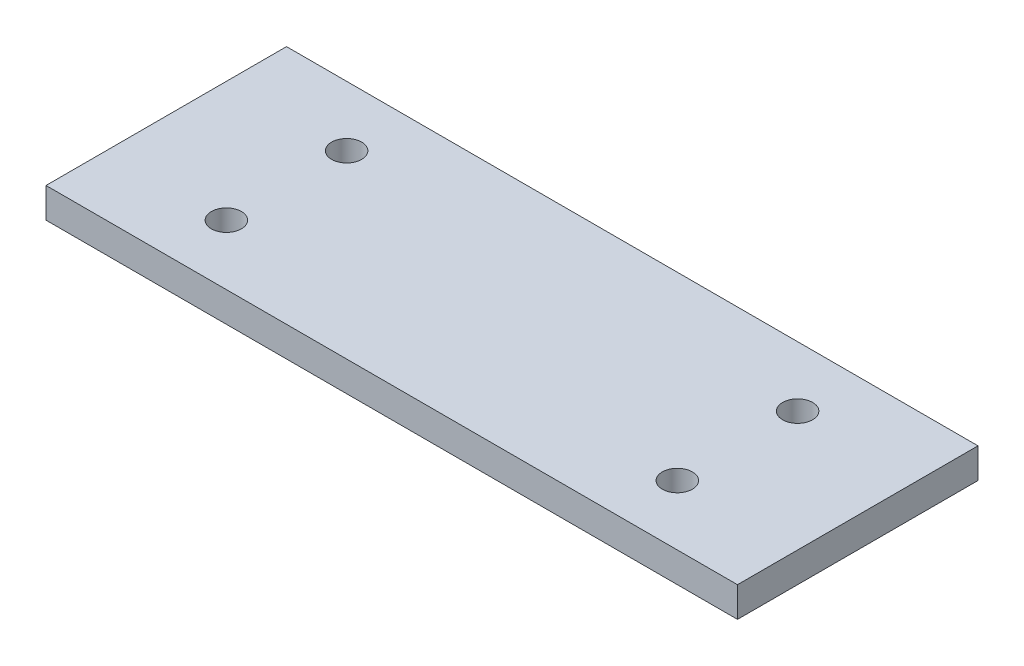
ISO-10303-21;
HEADER;
FILE_DESCRIPTION(('STEP AP214'),'2;1');
FILE_NAME('part.step','',(''),(''),'','','');
FILE_SCHEMA(('AUTOMOTIVE_DESIGN { 1 0 10303 214 1 1 1 1 }'));
ENDSEC;
DATA;
#1=APPLICATION_CONTEXT('core data for automotive mechanical design processes');
#2=APPLICATION_PROTOCOL_DEFINITION('international standard','automotive_design',2000,#1);
#3=PRODUCT_CONTEXT('',#1,'mechanical');
#4=PRODUCT('Part','Part','',(#3));
#5=PRODUCT_RELATED_PRODUCT_CATEGORY('part','',(#4));
#6=PRODUCT_DEFINITION_FORMATION('','',#4);
#7=PRODUCT_DEFINITION_CONTEXT('part definition',#1,'design');
#8=PRODUCT_DEFINITION('design','',#6,#7);
#9=PRODUCT_DEFINITION_SHAPE('','',#8);
#10=(LENGTH_UNIT() NAMED_UNIT(*) SI_UNIT(.MILLI.,.METRE.));
#11=(NAMED_UNIT(*) PLANE_ANGLE_UNIT() SI_UNIT($,.RADIAN.));
#12=(NAMED_UNIT(*) SI_UNIT($,.STERADIAN.) SOLID_ANGLE_UNIT());
#13=UNCERTAINTY_MEASURE_WITH_UNIT(LENGTH_MEASURE(1.E-05),#10,'distance_accuracy_value','');
#14=(GEOMETRIC_REPRESENTATION_CONTEXT(3) GLOBAL_UNCERTAINTY_ASSIGNED_CONTEXT((#13)) GLOBAL_UNIT_ASSIGNED_CONTEXT((#10,
#11,#12)) REPRESENTATION_CONTEXT('',''));
#15=CARTESIAN_POINT('',(0.,0.,0.));
#16=DIRECTION('',(0.,0.,1.));
#17=DIRECTION('',(1.,0.,0.));
#18=AXIS2_PLACEMENT_3D('',#15,#16,#17);
#19=CARTESIAN_POINT('',(0.,5.,0.));
#20=DIRECTION('',(0.,0.,-1.));
#21=DIRECTION('',(-1.,0.,0.));
#22=AXIS2_PLACEMENT_3D('',#19,#20,#21);
#23=PLANE('',#22);
#24=DIRECTION('',(1.,0.,0.));
#25=VECTOR('',#24,1.);
#26=CARTESIAN_POINT('',(0.,0.,0.));
#27=LINE('',#26,#25);
#28=CARTESIAN_POINT('',(0.,0.,0.));
#29=VERTEX_POINT('',#28);
#30=CARTESIAN_POINT('',(115.,0.,0.));
#31=VERTEX_POINT('',#30);
#32=EDGE_CURVE('E116',#29,#31,#27,.T.);
#33=ORIENTED_EDGE('',*,*,#32,.T.);
#34=DIRECTION('',(0.,-1.,0.));
#35=VECTOR('',#34,1.);
#36=CARTESIAN_POINT('',(115.,5.,0.));
#37=LINE('',#36,#35);
#38=CARTESIAN_POINT('',(115.,5.,0.));
#39=VERTEX_POINT('',#38);
#40=EDGE_CURVE('E11',#39,#31,#37,.T.);
#41=ORIENTED_EDGE('',*,*,#40,.F.);
#42=DIRECTION('',(1.,0.,0.));
#43=VECTOR('',#42,1.);
#44=CARTESIAN_POINT('',(0.,5.,0.));
#45=LINE('',#44,#43);
#46=CARTESIAN_POINT('',(0.,5.,0.));
#47=VERTEX_POINT('',#46);
#48=EDGE_CURVE('E90',#47,#39,#45,.T.);
#49=ORIENTED_EDGE('',*,*,#48,.F.);
#50=DIRECTION('',(0.,-1.,0.));
#51=VECTOR('',#50,1.);
#52=CARTESIAN_POINT('',(0.,5.,0.));
#53=LINE('',#52,#51);
#54=EDGE_CURVE('E56',#47,#29,#53,.T.);
#55=ORIENTED_EDGE('',*,*,#54,.T.);
#56=EDGE_LOOP('',(#33,#41,#49,#55));
#57=FACE_BOUND('',#56,.T.);
#58=ADVANCED_FACE('F39',(#57),#23,.F.);
#59=CARTESIAN_POINT('',(115.,5.,0.));
#60=DIRECTION('',(-1.,0.,0.));
#61=DIRECTION('',(0.,0.,1.));
#62=AXIS2_PLACEMENT_3D('',#59,#60,#61);
#63=PLANE('',#62);
#64=DIRECTION('',(0.,0.,-1.));
#65=VECTOR('',#64,1.);
#66=CARTESIAN_POINT('',(115.,0.,0.));
#67=LINE('',#66,#65);
#68=CARTESIAN_POINT('',(115.,0.,-40.));
#69=VERTEX_POINT('',#68);
#70=EDGE_CURVE('E95',#31,#69,#67,.T.);
#71=ORIENTED_EDGE('',*,*,#70,.T.);
#72=DIRECTION('',(0.,-1.,0.));
#73=VECTOR('',#72,1.);
#74=CARTESIAN_POINT('',(115.,5.,-40.));
#75=LINE('',#74,#73);
#76=CARTESIAN_POINT('',(115.,5.,-40.));
#77=VERTEX_POINT('',#76);
#78=EDGE_CURVE('E48',#77,#69,#75,.T.);
#79=ORIENTED_EDGE('',*,*,#78,.F.);
#80=DIRECTION('',(0.,0.,-1.));
#81=VECTOR('',#80,1.);
#82=CARTESIAN_POINT('',(115.,5.,0.));
#83=LINE('',#82,#81);
#84=EDGE_CURVE('E81',#39,#77,#83,.T.);
#85=ORIENTED_EDGE('',*,*,#84,.F.);
#86=ORIENTED_EDGE('',*,*,#40,.T.);
#87=EDGE_LOOP('',(#71,#79,#85,#86));
#88=FACE_BOUND('',#87,.T.);
#89=ADVANCED_FACE('F94',(#88),#63,.F.);
#90=CARTESIAN_POINT('',(0.,5.,-40.));
#91=DIRECTION('',(0.,0.,-1.));
#92=DIRECTION('',(-1.,0.,0.));
#93=AXIS2_PLACEMENT_3D('',#90,#91,#92);
#94=PLANE('',#93);
#95=DIRECTION('',(1.,0.,0.));
#96=VECTOR('',#95,1.);
#97=CARTESIAN_POINT('',(0.,0.,-40.));
#98=LINE('',#97,#96);
#99=CARTESIAN_POINT('',(0.,0.,-40.));
#100=VERTEX_POINT('',#99);
#101=EDGE_CURVE('E119',#100,#69,#98,.T.);
#102=ORIENTED_EDGE('',*,*,#101,.F.);
#103=DIRECTION('',(0.,-1.,0.));
#104=VECTOR('',#103,1.);
#105=CARTESIAN_POINT('',(0.,5.,-40.));
#106=LINE('',#105,#104);
#107=CARTESIAN_POINT('',(0.,5.,-40.));
#108=VERTEX_POINT('',#107);
#109=EDGE_CURVE('E70',#108,#100,#106,.T.);
#110=ORIENTED_EDGE('',*,*,#109,.F.);
#111=DIRECTION('',(1.,0.,0.));
#112=VECTOR('',#111,1.);
#113=CARTESIAN_POINT('',(0.,5.,-40.));
#114=LINE('',#113,#112);
#115=EDGE_CURVE('E89',#108,#77,#114,.T.);
#116=ORIENTED_EDGE('',*,*,#115,.T.);
#117=ORIENTED_EDGE('',*,*,#78,.T.);
#118=EDGE_LOOP('',(#102,#110,#116,#117));
#119=FACE_BOUND('',#118,.T.);
#120=ADVANCED_FACE('F98',(#119),#94,.T.);
#121=CARTESIAN_POINT('',(0.,5.,0.));
#122=DIRECTION('',(-1.,0.,0.));
#123=DIRECTION('',(0.,0.,1.));
#124=AXIS2_PLACEMENT_3D('',#121,#122,#123);
#125=PLANE('',#124);
#126=DIRECTION('',(0.,0.,-1.));
#127=VECTOR('',#126,1.);
#128=CARTESIAN_POINT('',(0.,0.,0.));
#129=LINE('',#128,#127);
#130=EDGE_CURVE('E121',#29,#100,#129,.T.);
#131=ORIENTED_EDGE('',*,*,#130,.F.);
#132=ORIENTED_EDGE('',*,*,#54,.F.);
#133=DIRECTION('',(0.,0.,-1.));
#134=VECTOR('',#133,1.);
#135=CARTESIAN_POINT('',(0.,5.,0.));
#136=LINE('',#135,#134);
#137=EDGE_CURVE('E99',#47,#108,#136,.T.);
#138=ORIENTED_EDGE('',*,*,#137,.T.);
#139=ORIENTED_EDGE('',*,*,#109,.T.);
#140=EDGE_LOOP('',(#131,#132,#138,#139));
#141=FACE_BOUND('',#140,.T.);
#142=ADVANCED_FACE('F169',(#141),#125,.T.);
#143=CARTESIAN_POINT('',(95.,5.,-30.));
#144=DIRECTION('',(0.,-1.,0.));
#145=DIRECTION('',(0.,0.,-1.));
#146=AXIS2_PLACEMENT_3D('',#143,#144,#145);
#147=CYLINDRICAL_SURFACE('',#146,2.5);
#148=CARTESIAN_POINT('',(95.,5.,-30.));
#149=DIRECTION('',(0.,1.,0.));
#150=DIRECTION('',(0.,0.,1.));
#151=AXIS2_PLACEMENT_3D('',#148,#149,#150);
#152=CIRCLE('',#151,2.5);
#153=CARTESIAN_POINT('',(95.,5.,-27.5));
#154=VERTEX_POINT('',#153);
#155=EDGE_CURVE('E137',#154,#154,#152,.T.);
#156=ORIENTED_EDGE('',*,*,#155,.T.);
#157=EDGE_LOOP('',(#156));
#158=FACE_BOUND('',#157,.T.);
#159=CARTESIAN_POINT('',(95.,0.,-30.));
#160=DIRECTION('',(0.,1.,0.));
#161=DIRECTION('',(0.,0.,1.));
#162=AXIS2_PLACEMENT_3D('',#159,#160,#161);
#163=CIRCLE('',#162,2.5);
#164=CARTESIAN_POINT('',(95.,0.,-27.5));
#165=VERTEX_POINT('',#164);
#166=EDGE_CURVE('E113',#165,#165,#163,.T.);
#167=ORIENTED_EDGE('',*,*,#166,.F.);
#168=EDGE_LOOP('',(#167));
#169=FACE_BOUND('',#168,.T.);
#170=ADVANCED_FACE('F143',(#158,#169),#147,.F.);
#171=CARTESIAN_POINT('',(95.,5.,-10.));
#172=DIRECTION('',(0.,-1.,0.));
#173=DIRECTION('',(0.,0.,-1.));
#174=AXIS2_PLACEMENT_3D('',#171,#172,#173);
#175=CYLINDRICAL_SURFACE('',#174,2.5);
#176=CARTESIAN_POINT('',(95.,5.,-10.));
#177=DIRECTION('',(0.,1.,0.));
#178=DIRECTION('',(0.,0.,1.));
#179=AXIS2_PLACEMENT_3D('',#176,#177,#178);
#180=CIRCLE('',#179,2.5);
#181=CARTESIAN_POINT('',(95.,5.,-7.50000000000001));
#182=VERTEX_POINT('',#181);
#183=EDGE_CURVE('E132',#182,#182,#180,.T.);
#184=ORIENTED_EDGE('',*,*,#183,.T.);
#185=EDGE_LOOP('',(#184));
#186=FACE_BOUND('',#185,.T.);
#187=CARTESIAN_POINT('',(95.,0.,-10.));
#188=DIRECTION('',(0.,1.,0.));
#189=DIRECTION('',(0.,0.,1.));
#190=AXIS2_PLACEMENT_3D('',#187,#188,#189);
#191=CIRCLE('',#190,2.5);
#192=CARTESIAN_POINT('',(95.,0.,-7.50000000000001));
#193=VERTEX_POINT('',#192);
#194=EDGE_CURVE('E110',#193,#193,#191,.T.);
#195=ORIENTED_EDGE('',*,*,#194,.F.);
#196=EDGE_LOOP('',(#195));
#197=FACE_BOUND('',#196,.T.);
#198=ADVANCED_FACE('F168',(#186,#197),#175,.F.);
#199=CARTESIAN_POINT('',(20.,5.,-10.));
#200=DIRECTION('',(0.,-1.,0.));
#201=DIRECTION('',(0.,0.,-1.));
#202=AXIS2_PLACEMENT_3D('',#199,#200,#201);
#203=CYLINDRICAL_SURFACE('',#202,2.5);
#204=CARTESIAN_POINT('',(20.,5.,-10.));
#205=DIRECTION('',(0.,1.,0.));
#206=DIRECTION('',(0.,0.,1.));
#207=AXIS2_PLACEMENT_3D('',#204,#205,#206);
#208=CIRCLE('',#207,2.5);
#209=CARTESIAN_POINT('',(20.,5.,-7.50000000000001));
#210=VERTEX_POINT('',#209);
#211=EDGE_CURVE('E127',#210,#210,#208,.F.);
#212=ORIENTED_EDGE('',*,*,#211,.F.);
#213=EDGE_LOOP('',(#212));
#214=FACE_BOUND('',#213,.T.);
#215=CARTESIAN_POINT('',(20.,0.,-10.));
#216=DIRECTION('',(0.,1.,0.));
#217=DIRECTION('',(0.,0.,1.));
#218=AXIS2_PLACEMENT_3D('',#215,#216,#217);
#219=CIRCLE('',#218,2.5);
#220=CARTESIAN_POINT('',(20.,0.,-7.50000000000001));
#221=VERTEX_POINT('',#220);
#222=EDGE_CURVE('E107',#221,#221,#219,.F.);
#223=ORIENTED_EDGE('',*,*,#222,.T.);
#224=EDGE_LOOP('',(#223));
#225=FACE_BOUND('',#224,.T.);
#226=ADVANCED_FACE('F41',(#214,#225),#203,.F.);
#227=CARTESIAN_POINT('',(20.,5.,-30.));
#228=DIRECTION('',(0.,-1.,0.));
#229=DIRECTION('',(0.,0.,-1.));
#230=AXIS2_PLACEMENT_3D('',#227,#228,#229);
#231=CYLINDRICAL_SURFACE('',#230,2.5);
#232=CARTESIAN_POINT('',(20.,5.,-30.));
#233=DIRECTION('',(0.,1.,0.));
#234=DIRECTION('',(0.,0.,1.));
#235=AXIS2_PLACEMENT_3D('',#232,#233,#234);
#236=CIRCLE('',#235,2.5);
#237=CARTESIAN_POINT('',(20.,5.,-27.5));
#238=VERTEX_POINT('',#237);
#239=EDGE_CURVE('E101',#238,#238,#236,.F.);
#240=ORIENTED_EDGE('',*,*,#239,.F.);
#241=EDGE_LOOP('',(#240));
#242=FACE_BOUND('',#241,.T.);
#243=CARTESIAN_POINT('',(20.,0.,-30.));
#244=DIRECTION('',(0.,1.,0.));
#245=DIRECTION('',(0.,0.,1.));
#246=AXIS2_PLACEMENT_3D('',#243,#244,#245);
#247=CIRCLE('',#246,2.5);
#248=CARTESIAN_POINT('',(20.,0.,-27.5));
#249=VERTEX_POINT('',#248);
#250=EDGE_CURVE('E124',#249,#249,#247,.F.);
#251=ORIENTED_EDGE('',*,*,#250,.T.);
#252=EDGE_LOOP('',(#251));
#253=FACE_BOUND('',#252,.T.);
#254=ADVANCED_FACE('F148',(#242,#253),#231,.F.);
#255=CARTESIAN_POINT('',(0.,5.,0.));
#256=DIRECTION('',(0.,1.,0.));
#257=DIRECTION('',(0.,0.,1.));
#258=AXIS2_PLACEMENT_3D('',#255,#256,#257);
#259=PLANE('',#258);
#260=ORIENTED_EDGE('',*,*,#211,.T.);
#261=EDGE_LOOP('',(#260));
#262=FACE_BOUND('',#261,.T.);
#263=ORIENTED_EDGE('',*,*,#183,.F.);
#264=EDGE_LOOP('',(#263));
#265=FACE_BOUND('',#264,.T.);
#266=ORIENTED_EDGE('',*,*,#155,.F.);
#267=EDGE_LOOP('',(#266));
#268=FACE_BOUND('',#267,.T.);
#269=ORIENTED_EDGE('',*,*,#48,.T.);
#270=ORIENTED_EDGE('',*,*,#84,.T.);
#271=ORIENTED_EDGE('',*,*,#115,.F.);
#272=ORIENTED_EDGE('',*,*,#137,.F.);
#273=EDGE_LOOP('',(#269,#270,#271,#272));
#274=FACE_BOUND('',#273,.T.);
#275=ORIENTED_EDGE('',*,*,#239,.T.);
#276=EDGE_LOOP('',(#275));
#277=FACE_BOUND('',#276,.T.);
#278=ADVANCED_FACE('F85',(#262,#265,#268,#274,#277),#259,.T.);
#279=CARTESIAN_POINT('',(0.,0.,0.));
#280=DIRECTION('',(0.,1.,0.));
#281=DIRECTION('',(0.,0.,1.));
#282=AXIS2_PLACEMENT_3D('',#279,#280,#281);
#283=PLANE('',#282);
#284=ORIENTED_EDGE('',*,*,#222,.F.);
#285=EDGE_LOOP('',(#284));
#286=FACE_BOUND('',#285,.T.);
#287=ORIENTED_EDGE('',*,*,#194,.T.);
#288=EDGE_LOOP('',(#287));
#289=FACE_BOUND('',#288,.T.);
#290=ORIENTED_EDGE('',*,*,#166,.T.);
#291=EDGE_LOOP('',(#290));
#292=FACE_BOUND('',#291,.T.);
#293=ORIENTED_EDGE('',*,*,#32,.F.);
#294=ORIENTED_EDGE('',*,*,#130,.T.);
#295=ORIENTED_EDGE('',*,*,#101,.T.);
#296=ORIENTED_EDGE('',*,*,#70,.F.);
#297=EDGE_LOOP('',(#293,#294,#295,#296));
#298=FACE_BOUND('',#297,.T.);
#299=ORIENTED_EDGE('',*,*,#250,.F.);
#300=EDGE_LOOP('',(#299));
#301=FACE_BOUND('',#300,.T.);
#302=ADVANCED_FACE('F147',(#286,#289,#292,#298,#301),#283,.F.);
#303=CLOSED_SHELL('',(#58,#89,#120,#142,#170,#198,#226,#254,#278,#302));
#304=MANIFOLD_SOLID_BREP('B2',#303);
#305=ADVANCED_BREP_SHAPE_REPRESENTATION('',(#18,#304),#14);
#306=SHAPE_DEFINITION_REPRESENTATION(#9,#305);
ENDSEC;
END-ISO-10303-21;
